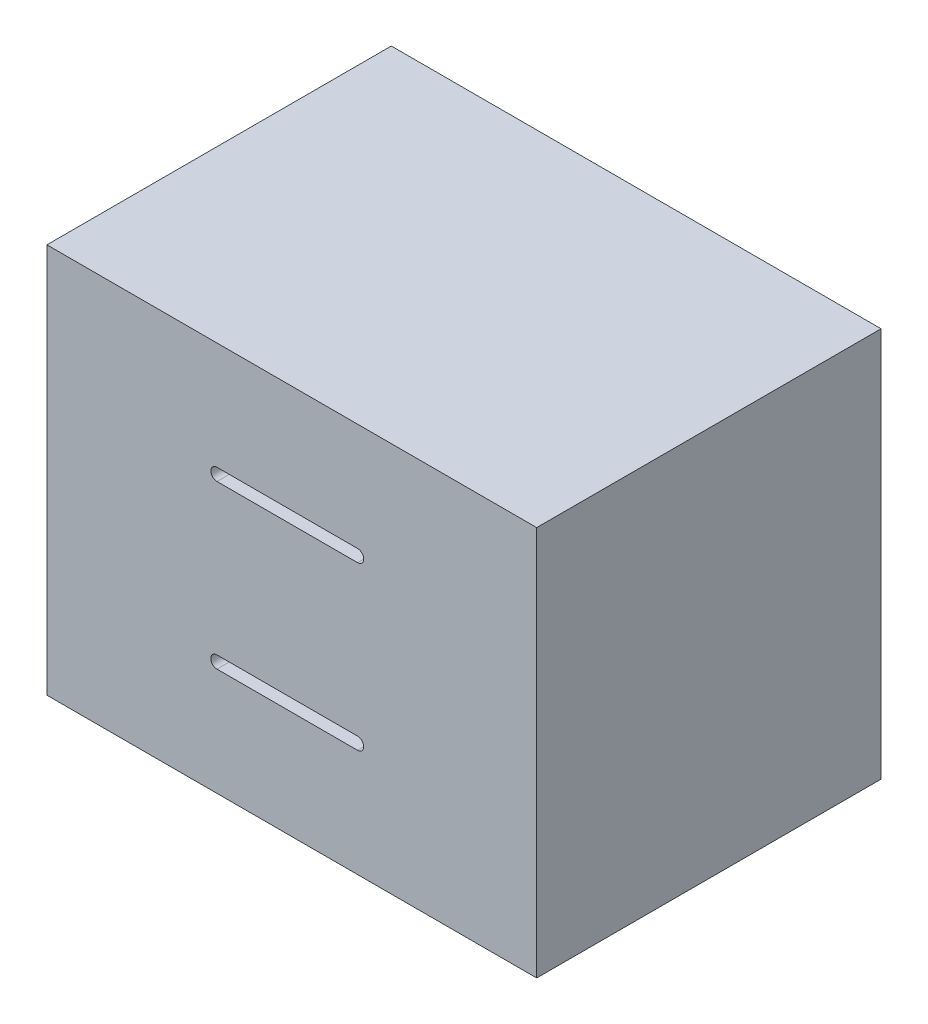
ISO-10303-21;
HEADER;
FILE_DESCRIPTION(('STEP AP214'),'2;1');
FILE_NAME('part.step','',(''),(''),'','','');
FILE_SCHEMA(('AUTOMOTIVE_DESIGN { 1 0 10303 214 1 1 1 1 }'));
ENDSEC;
DATA;
#1=APPLICATION_CONTEXT('core data for automotive mechanical design processes');
#2=APPLICATION_PROTOCOL_DEFINITION('international standard','automotive_design',2000,#1);
#3=PRODUCT_CONTEXT('',#1,'mechanical');
#4=PRODUCT('Part','Part','',(#3));
#5=PRODUCT_RELATED_PRODUCT_CATEGORY('part','',(#4));
#6=PRODUCT_DEFINITION_FORMATION('','',#4);
#7=PRODUCT_DEFINITION_CONTEXT('part definition',#1,'design');
#8=PRODUCT_DEFINITION('design','',#6,#7);
#9=PRODUCT_DEFINITION_SHAPE('','',#8);
#10=(LENGTH_UNIT() NAMED_UNIT(*) SI_UNIT(.MILLI.,.METRE.));
#11=(NAMED_UNIT(*) PLANE_ANGLE_UNIT() SI_UNIT($,.RADIAN.));
#12=(NAMED_UNIT(*) SI_UNIT($,.STERADIAN.) SOLID_ANGLE_UNIT());
#13=UNCERTAINTY_MEASURE_WITH_UNIT(LENGTH_MEASURE(1.E-05),#10,'distance_accuracy_value','');
#14=(GEOMETRIC_REPRESENTATION_CONTEXT(3) GLOBAL_UNCERTAINTY_ASSIGNED_CONTEXT((#13)) GLOBAL_UNIT_ASSIGNED_CONTEXT((#10,
#11,#12)) REPRESENTATION_CONTEXT('',''));
#15=CARTESIAN_POINT('',(0.,0.,0.));
#16=DIRECTION('',(0.,0.,1.));
#17=DIRECTION('',(1.,0.,0.));
#18=AXIS2_PLACEMENT_3D('',#15,#16,#17);
#19=CARTESIAN_POINT('',(-26.9,42.85,18.915));
#20=DIRECTION('',(0.,0.,-1.));
#21=DIRECTION('',(-1.,0.,0.));
#22=AXIS2_PLACEMENT_3D('',#19,#20,#21);
#23=PLANE('',#22);
#24=CARTESIAN_POINT('',(7.225,12.5,18.915));
#25=DIRECTION('',(0.,0.,-1.));
#26=DIRECTION('',(-1.,0.,0.));
#27=AXIS2_PLACEMENT_3D('',#24,#25,#26);
#28=CIRCLE('',#27,0.675);
#29=CARTESIAN_POINT('',(7.22500000000001,13.175,18.915));
#30=VERTEX_POINT('',#29);
#31=CARTESIAN_POINT('',(7.225,11.825,18.915));
#32=VERTEX_POINT('',#31);
#33=EDGE_CURVE('E70',#30,#32,#28,.T.);
#34=ORIENTED_EDGE('',*,*,#33,.T.);
#35=DIRECTION('',(-1.,0.,0.));
#36=VECTOR('',#35,1.);
#37=CARTESIAN_POINT('',(7.225,11.825,18.915));
#38=LINE('',#37,#36);
#39=CARTESIAN_POINT('',(-8.225,11.825,18.915));
#40=VERTEX_POINT('',#39);
#41=EDGE_CURVE('E230',#32,#40,#38,.T.);
#42=ORIENTED_EDGE('',*,*,#41,.T.);
#43=CARTESIAN_POINT('',(-8.225,12.5,18.915));
#44=DIRECTION('',(0.,0.,-1.));
#45=DIRECTION('',(-1.,0.,0.));
#46=AXIS2_PLACEMENT_3D('',#43,#44,#45);
#47=CIRCLE('',#46,0.675);
#48=CARTESIAN_POINT('',(-8.225,13.175,18.915));
#49=VERTEX_POINT('',#48);
#50=EDGE_CURVE('E241',#40,#49,#47,.T.);
#51=ORIENTED_EDGE('',*,*,#50,.T.);
#52=DIRECTION('',(1.,0.,0.));
#53=VECTOR('',#52,1.);
#54=CARTESIAN_POINT('',(7.225,13.175,18.915));
#55=LINE('',#54,#53);
#56=EDGE_CURVE('E238',#49,#30,#55,.T.);
#57=ORIENTED_EDGE('',*,*,#56,.T.);
#58=EDGE_LOOP('',(#34,#42,#51,#57));
#59=FACE_BOUND('',#58,.T.);
#60=DIRECTION('',(1.,0.,0.));
#61=VECTOR('',#60,1.);
#62=CARTESIAN_POINT('',(-26.9,0.,18.915));
#63=LINE('',#62,#61);
#64=CARTESIAN_POINT('',(-26.9,0.,18.915));
#65=VERTEX_POINT('',#64);
#66=CARTESIAN_POINT('',(26.9,0.,18.915));
#67=VERTEX_POINT('',#66);
#68=EDGE_CURVE('E320',#65,#67,#63,.T.);
#69=ORIENTED_EDGE('',*,*,#68,.T.);
#70=DIRECTION('',(0.,-1.,0.));
#71=VECTOR('',#70,1.);
#72=CARTESIAN_POINT('',(26.9,42.85,18.915));
#73=LINE('',#72,#71);
#74=CARTESIAN_POINT('',(26.9,42.85,18.915));
#75=VERTEX_POINT('',#74);
#76=EDGE_CURVE('E326',#75,#67,#73,.T.);
#77=ORIENTED_EDGE('',*,*,#76,.F.);
#78=DIRECTION('',(1.,0.,0.));
#79=VECTOR('',#78,1.);
#80=CARTESIAN_POINT('',(-26.9,42.85,18.915));
#81=LINE('',#80,#79);
#82=CARTESIAN_POINT('',(-26.9,42.85,18.915));
#83=VERTEX_POINT('',#82);
#84=EDGE_CURVE('E324',#83,#75,#81,.T.);
#85=ORIENTED_EDGE('',*,*,#84,.F.);
#86=DIRECTION('',(0.,-1.,0.));
#87=VECTOR('',#86,1.);
#88=CARTESIAN_POINT('',(-26.9,42.85,18.915));
#89=LINE('',#88,#87);
#90=EDGE_CURVE('E336',#83,#65,#89,.T.);
#91=ORIENTED_EDGE('',*,*,#90,.T.);
#92=EDGE_LOOP('',(#69,#77,#85,#91));
#93=FACE_BOUND('',#92,.T.);
#94=CARTESIAN_POINT('',(7.225,30.35,18.915));
#95=DIRECTION('',(0.,0.,-1.));
#96=DIRECTION('',(-1.,0.,0.));
#97=AXIS2_PLACEMENT_3D('',#94,#95,#96);
#98=CIRCLE('',#97,0.674999999999998);
#99=CARTESIAN_POINT('',(7.22500000000001,31.025,18.915));
#100=VERTEX_POINT('',#99);
#101=CARTESIAN_POINT('',(7.225,29.675,18.915));
#102=VERTEX_POINT('',#101);
#103=EDGE_CURVE('E62',#100,#102,#98,.T.);
#104=ORIENTED_EDGE('',*,*,#103,.T.);
#105=DIRECTION('',(-1.,0.,0.));
#106=VECTOR('',#105,1.);
#107=CARTESIAN_POINT('',(7.225,29.675,18.915));
#108=LINE('',#107,#106);
#109=CARTESIAN_POINT('',(-8.225,29.675,18.915));
#110=VERTEX_POINT('',#109);
#111=EDGE_CURVE('E206',#102,#110,#108,.T.);
#112=ORIENTED_EDGE('',*,*,#111,.T.);
#113=CARTESIAN_POINT('',(-8.225,30.35,18.915));
#114=DIRECTION('',(0.,0.,-1.));
#115=DIRECTION('',(-1.,0.,0.));
#116=AXIS2_PLACEMENT_3D('',#113,#114,#115);
#117=CIRCLE('',#116,0.674999999999998);
#118=CARTESIAN_POINT('',(-8.225,31.025,18.915));
#119=VERTEX_POINT('',#118);
#120=EDGE_CURVE('E209',#110,#119,#117,.T.);
#121=ORIENTED_EDGE('',*,*,#120,.T.);
#122=DIRECTION('',(1.,0.,0.));
#123=VECTOR('',#122,1.);
#124=CARTESIAN_POINT('',(7.225,31.025,18.915));
#125=LINE('',#124,#123);
#126=EDGE_CURVE('E215',#119,#100,#125,.T.);
#127=ORIENTED_EDGE('',*,*,#126,.T.);
#128=EDGE_LOOP('',(#104,#112,#121,#127));
#129=FACE_BOUND('',#128,.T.);
#130=ADVANCED_FACE('F47',(#59,#93,#129),#23,.F.);
#131=CARTESIAN_POINT('',(26.9,42.85,18.915));
#132=DIRECTION('',(-1.,0.,0.));
#133=DIRECTION('',(0.,0.,1.));
#134=AXIS2_PLACEMENT_3D('',#131,#132,#133);
#135=PLANE('',#134);
#136=DIRECTION('',(0.,0.,-1.));
#137=VECTOR('',#136,1.);
#138=CARTESIAN_POINT('',(26.9,0.,18.915));
#139=LINE('',#138,#137);
#140=CARTESIAN_POINT('',(26.9,0.,-18.915));
#141=VERTEX_POINT('',#140);
#142=EDGE_CURVE('E279',#67,#141,#139,.T.);
#143=ORIENTED_EDGE('',*,*,#142,.T.);
#144=DIRECTION('',(0.,-1.,0.));
#145=VECTOR('',#144,1.);
#146=CARTESIAN_POINT('',(26.9,42.85,-18.915));
#147=LINE('',#146,#145);
#148=CARTESIAN_POINT('',(26.9,42.85,-18.915));
#149=VERTEX_POINT('',#148);
#150=EDGE_CURVE('E11',#149,#141,#147,.T.);
#151=ORIENTED_EDGE('',*,*,#150,.F.);
#152=DIRECTION('',(0.,0.,-1.));
#153=VECTOR('',#152,1.);
#154=CARTESIAN_POINT('',(26.9,42.85,18.915));
#155=LINE('',#154,#153);
#156=EDGE_CURVE('E316',#75,#149,#155,.T.);
#157=ORIENTED_EDGE('',*,*,#156,.F.);
#158=ORIENTED_EDGE('',*,*,#76,.T.);
#159=EDGE_LOOP('',(#143,#151,#157,#158));
#160=FACE_BOUND('',#159,.T.);
#161=ADVANCED_FACE('F49',(#160),#135,.F.);
#162=CARTESIAN_POINT('',(-26.9,42.85,-18.915));
#163=DIRECTION('',(0.,0.,1.));
#164=DIRECTION('',(1.,0.,0.));
#165=AXIS2_PLACEMENT_3D('',#162,#163,#164);
#166=PLANE('',#165);
#167=DIRECTION('',(-1.,0.,0.));
#168=VECTOR('',#167,1.);
#169=CARTESIAN_POINT('',(7.225,29.675,-18.915));
#170=LINE('',#169,#168);
#171=CARTESIAN_POINT('',(7.22500000000001,29.675,-18.915));
#172=VERTEX_POINT('',#171);
#173=CARTESIAN_POINT('',(-8.225,29.675,-18.915));
#174=VERTEX_POINT('',#173);
#175=EDGE_CURVE('E268',#172,#174,#170,.T.);
#176=ORIENTED_EDGE('',*,*,#175,.F.);
#177=CARTESIAN_POINT('',(7.225,30.35,-18.915));
#178=DIRECTION('',(0.,0.,-1.));
#179=DIRECTION('',(-1.,0.,0.));
#180=AXIS2_PLACEMENT_3D('',#177,#178,#179);
#181=CIRCLE('',#180,0.674999999999998);
#182=CARTESIAN_POINT('',(7.225,31.025,-18.915));
#183=VERTEX_POINT('',#182);
#184=EDGE_CURVE('E266',#183,#172,#181,.T.);
#185=ORIENTED_EDGE('',*,*,#184,.F.);
#186=DIRECTION('',(1.,0.,0.));
#187=VECTOR('',#186,1.);
#188=CARTESIAN_POINT('',(7.225,31.025,-18.915));
#189=LINE('',#188,#187);
#190=CARTESIAN_POINT('',(-8.225,31.025,-18.915));
#191=VERTEX_POINT('',#190);
#192=EDGE_CURVE('E256',#191,#183,#189,.T.);
#193=ORIENTED_EDGE('',*,*,#192,.F.);
#194=CARTESIAN_POINT('',(-8.225,30.35,-18.915));
#195=DIRECTION('',(0.,0.,-1.));
#196=DIRECTION('',(-1.,0.,0.));
#197=AXIS2_PLACEMENT_3D('',#194,#195,#196);
#198=CIRCLE('',#197,0.674999999999998);
#199=EDGE_CURVE('E272',#174,#191,#198,.T.);
#200=ORIENTED_EDGE('',*,*,#199,.F.);
#201=EDGE_LOOP('',(#176,#185,#193,#200));
#202=FACE_BOUND('',#201,.T.);
#203=DIRECTION('',(-1.,0.,0.));
#204=VECTOR('',#203,1.);
#205=CARTESIAN_POINT('',(7.225,11.825,-18.915));
#206=LINE('',#205,#204);
#207=CARTESIAN_POINT('',(7.22500000000001,11.825,-18.915));
#208=VERTEX_POINT('',#207);
#209=CARTESIAN_POINT('',(-8.225,11.825,-18.915));
#210=VERTEX_POINT('',#209);
#211=EDGE_CURVE('E302',#208,#210,#206,.T.);
#212=ORIENTED_EDGE('',*,*,#211,.F.);
#213=CARTESIAN_POINT('',(7.225,12.5,-18.915));
#214=DIRECTION('',(0.,0.,-1.));
#215=DIRECTION('',(-1.,0.,0.));
#216=AXIS2_PLACEMENT_3D('',#213,#214,#215);
#217=CIRCLE('',#216,0.675);
#218=CARTESIAN_POINT('',(7.225,13.175,-18.915));
#219=VERTEX_POINT('',#218);
#220=EDGE_CURVE('E269',#219,#208,#217,.T.);
#221=ORIENTED_EDGE('',*,*,#220,.F.);
#222=DIRECTION('',(1.,0.,0.));
#223=VECTOR('',#222,1.);
#224=CARTESIAN_POINT('',(7.225,13.175,-18.915));
#225=LINE('',#224,#223);
#226=CARTESIAN_POINT('',(-8.225,13.175,-18.915));
#227=VERTEX_POINT('',#226);
#228=EDGE_CURVE('E295',#227,#219,#225,.T.);
#229=ORIENTED_EDGE('',*,*,#228,.F.);
#230=CARTESIAN_POINT('',(-8.225,12.5,-18.915));
#231=DIRECTION('',(0.,0.,-1.));
#232=DIRECTION('',(-1.,0.,0.));
#233=AXIS2_PLACEMENT_3D('',#230,#231,#232);
#234=CIRCLE('',#233,0.675);
#235=EDGE_CURVE('E298',#210,#227,#234,.T.);
#236=ORIENTED_EDGE('',*,*,#235,.F.);
#237=EDGE_LOOP('',(#212,#221,#229,#236));
#238=FACE_BOUND('',#237,.T.);
#239=DIRECTION('',(-1.,0.,0.));
#240=VECTOR('',#239,1.);
#241=CARTESIAN_POINT('',(-26.9,0.,-18.915));
#242=LINE('',#241,#240);
#243=CARTESIAN_POINT('',(-26.9,0.,-18.915));
#244=VERTEX_POINT('',#243);
#245=EDGE_CURVE('E329',#141,#244,#242,.T.);
#246=ORIENTED_EDGE('',*,*,#245,.T.);
#247=DIRECTION('',(0.,-1.,0.));
#248=VECTOR('',#247,1.);
#249=CARTESIAN_POINT('',(-26.9,42.85,-18.915));
#250=LINE('',#249,#248);
#251=CARTESIAN_POINT('',(-26.9,42.85,-18.915));
#252=VERTEX_POINT('',#251);
#253=EDGE_CURVE('E55',#252,#244,#250,.T.);
#254=ORIENTED_EDGE('',*,*,#253,.F.);
#255=DIRECTION('',(-1.,0.,0.));
#256=VECTOR('',#255,1.);
#257=CARTESIAN_POINT('',(-26.9,42.85,-18.915));
#258=LINE('',#257,#256);
#259=EDGE_CURVE('E319',#149,#252,#258,.T.);
#260=ORIENTED_EDGE('',*,*,#259,.F.);
#261=ORIENTED_EDGE('',*,*,#150,.T.);
#262=EDGE_LOOP('',(#246,#254,#260,#261));
#263=FACE_BOUND('',#262,.T.);
#264=ADVANCED_FACE('F359',(#202,#238,#263),#166,.F.);
#265=CARTESIAN_POINT('',(-26.9,42.85,18.915));
#266=DIRECTION('',(1.,0.,0.));
#267=DIRECTION('',(0.,0.,-1.));
#268=AXIS2_PLACEMENT_3D('',#265,#266,#267);
#269=PLANE('',#268);
#270=DIRECTION('',(0.,0.,1.));
#271=VECTOR('',#270,1.);
#272=CARTESIAN_POINT('',(-26.9,0.,18.915));
#273=LINE('',#272,#271);
#274=EDGE_CURVE('E331',#244,#65,#273,.T.);
#275=ORIENTED_EDGE('',*,*,#274,.T.);
#276=ORIENTED_EDGE('',*,*,#90,.F.);
#277=DIRECTION('',(0.,0.,1.));
#278=VECTOR('',#277,1.);
#279=CARTESIAN_POINT('',(-26.9,42.85,18.915));
#280=LINE('',#279,#278);
#281=EDGE_CURVE('E322',#252,#83,#280,.T.);
#282=ORIENTED_EDGE('',*,*,#281,.F.);
#283=ORIENTED_EDGE('',*,*,#253,.T.);
#284=EDGE_LOOP('',(#275,#276,#282,#283));
#285=FACE_BOUND('',#284,.T.);
#286=ADVANCED_FACE('F343',(#285),#269,.F.);
#287=CARTESIAN_POINT('',(0.,42.85,0.));
#288=DIRECTION('',(0.,-1.,0.));
#289=DIRECTION('',(0.,0.,-1.));
#290=AXIS2_PLACEMENT_3D('',#287,#288,#289);
#291=PLANE('',#290);
#292=ORIENTED_EDGE('',*,*,#156,.T.);
#293=ORIENTED_EDGE('',*,*,#259,.T.);
#294=ORIENTED_EDGE('',*,*,#281,.T.);
#295=ORIENTED_EDGE('',*,*,#84,.T.);
#296=EDGE_LOOP('',(#292,#293,#294,#295));
#297=FACE_BOUND('',#296,.T.);
#298=ADVANCED_FACE('F358',(#297),#291,.F.);
#299=CARTESIAN_POINT('',(0.,0.,0.));
#300=DIRECTION('',(0.,-1.,0.));
#301=DIRECTION('',(0.,0.,-1.));
#302=AXIS2_PLACEMENT_3D('',#299,#300,#301);
#303=PLANE('',#302);
#304=ORIENTED_EDGE('',*,*,#142,.F.);
#305=ORIENTED_EDGE('',*,*,#68,.F.);
#306=ORIENTED_EDGE('',*,*,#274,.F.);
#307=ORIENTED_EDGE('',*,*,#245,.F.);
#308=EDGE_LOOP('',(#304,#305,#306,#307));
#309=FACE_BOUND('',#308,.T.);
#310=ADVANCED_FACE('F349',(#309),#303,.T.);
#311=CARTESIAN_POINT('',(7.225,12.5,-16.915));
#312=DIRECTION('',(0.,0.,-1.));
#313=DIRECTION('',(-1.,0.,0.));
#314=AXIS2_PLACEMENT_3D('',#311,#312,#313);
#315=CYLINDRICAL_SURFACE('',#314,0.675);
#316=ORIENTED_EDGE('',*,*,#220,.T.);
#317=DIRECTION('',(0.,0.,-1.));
#318=VECTOR('',#317,1.);
#319=CARTESIAN_POINT('',(7.225,11.825,-16.915));
#320=LINE('',#319,#318);
#321=CARTESIAN_POINT('',(7.225,11.825,-16.915));
#322=VERTEX_POINT('',#321);
#323=EDGE_CURVE('E286',#322,#208,#320,.T.);
#324=ORIENTED_EDGE('',*,*,#323,.F.);
#325=CARTESIAN_POINT('',(7.225,12.5,-16.915));
#326=DIRECTION('',(0.,0.,-1.));
#327=DIRECTION('',(-1.,0.,0.));
#328=AXIS2_PLACEMENT_3D('',#325,#326,#327);
#329=CIRCLE('',#328,0.675);
#330=CARTESIAN_POINT('',(7.225,13.175,-16.915));
#331=VERTEX_POINT('',#330);
#332=EDGE_CURVE('E299',#331,#322,#329,.T.);
#333=ORIENTED_EDGE('',*,*,#332,.F.);
#334=DIRECTION('',(0.,0.,-1.));
#335=VECTOR('',#334,1.);
#336=CARTESIAN_POINT('',(7.225,13.175,-16.915));
#337=LINE('',#336,#335);
#338=EDGE_CURVE('E222',#331,#219,#337,.T.);
#339=ORIENTED_EDGE('',*,*,#338,.T.);
#340=EDGE_LOOP('',(#316,#324,#333,#339));
#341=FACE_BOUND('',#340,.T.);
#342=ADVANCED_FACE('F380',(#341),#315,.F.);
#343=CARTESIAN_POINT('',(7.225,13.175,-16.915));
#344=DIRECTION('',(0.,1.,0.));
#345=DIRECTION('',(0.,0.,1.));
#346=AXIS2_PLACEMENT_3D('',#343,#344,#345);
#347=PLANE('',#346);
#348=ORIENTED_EDGE('',*,*,#228,.T.);
#349=ORIENTED_EDGE('',*,*,#338,.F.);
#350=DIRECTION('',(1.,0.,0.));
#351=VECTOR('',#350,1.);
#352=CARTESIAN_POINT('',(7.225,13.175,-16.915));
#353=LINE('',#352,#351);
#354=CARTESIAN_POINT('',(-8.225,13.175,-16.915));
#355=VERTEX_POINT('',#354);
#356=EDGE_CURVE('E289',#355,#331,#353,.T.);
#357=ORIENTED_EDGE('',*,*,#356,.F.);
#358=DIRECTION('',(0.,0.,-1.));
#359=VECTOR('',#358,1.);
#360=CARTESIAN_POINT('',(-8.225,13.175,-16.915));
#361=LINE('',#360,#359);
#362=EDGE_CURVE('E292',#355,#227,#361,.T.);
#363=ORIENTED_EDGE('',*,*,#362,.T.);
#364=EDGE_LOOP('',(#348,#349,#357,#363));
#365=FACE_BOUND('',#364,.T.);
#366=ADVANCED_FACE('F389',(#365),#347,.F.);
#367=CARTESIAN_POINT('',(-8.225,12.5,-16.915));
#368=DIRECTION('',(0.,0.,-1.));
#369=DIRECTION('',(-1.,0.,0.));
#370=AXIS2_PLACEMENT_3D('',#367,#368,#369);
#371=CYLINDRICAL_SURFACE('',#370,0.675);
#372=ORIENTED_EDGE('',*,*,#235,.T.);
#373=ORIENTED_EDGE('',*,*,#362,.F.);
#374=CARTESIAN_POINT('',(-8.225,12.5,-16.915));
#375=DIRECTION('',(0.,0.,-1.));
#376=DIRECTION('',(-1.,0.,0.));
#377=AXIS2_PLACEMENT_3D('',#374,#375,#376);
#378=CIRCLE('',#377,0.675);
#379=CARTESIAN_POINT('',(-8.225,11.825,-16.915));
#380=VERTEX_POINT('',#379);
#381=EDGE_CURVE('E308',#380,#355,#378,.T.);
#382=ORIENTED_EDGE('',*,*,#381,.F.);
#383=DIRECTION('',(0.,0.,-1.));
#384=VECTOR('',#383,1.);
#385=CARTESIAN_POINT('',(-8.225,11.825,-16.915));
#386=LINE('',#385,#384);
#387=EDGE_CURVE('E290',#380,#210,#386,.T.);
#388=ORIENTED_EDGE('',*,*,#387,.T.);
#389=EDGE_LOOP('',(#372,#373,#382,#388));
#390=FACE_BOUND('',#389,.T.);
#391=ADVANCED_FACE('F392',(#390),#371,.F.);
#392=CARTESIAN_POINT('',(7.225,11.825,-16.915));
#393=DIRECTION('',(0.,-1.,0.));
#394=DIRECTION('',(0.,0.,-1.));
#395=AXIS2_PLACEMENT_3D('',#392,#393,#394);
#396=PLANE('',#395);
#397=ORIENTED_EDGE('',*,*,#211,.T.);
#398=ORIENTED_EDGE('',*,*,#387,.F.);
#399=DIRECTION('',(-1.,0.,0.));
#400=VECTOR('',#399,1.);
#401=CARTESIAN_POINT('',(7.225,11.825,-16.915));
#402=LINE('',#401,#400);
#403=EDGE_CURVE('E311',#322,#380,#402,.T.);
#404=ORIENTED_EDGE('',*,*,#403,.F.);
#405=ORIENTED_EDGE('',*,*,#323,.T.);
#406=EDGE_LOOP('',(#397,#398,#404,#405));
#407=FACE_BOUND('',#406,.T.);
#408=ADVANCED_FACE('F387',(#407),#396,.F.);
#409=CARTESIAN_POINT('',(7.225,12.5,-16.915));
#410=DIRECTION('',(0.,0.,-1.));
#411=DIRECTION('',(-1.,0.,0.));
#412=AXIS2_PLACEMENT_3D('',#409,#410,#411);
#413=PLANE('',#412);
#414=ORIENTED_EDGE('',*,*,#332,.T.);
#415=ORIENTED_EDGE('',*,*,#403,.T.);
#416=ORIENTED_EDGE('',*,*,#381,.T.);
#417=ORIENTED_EDGE('',*,*,#356,.T.);
#418=EDGE_LOOP('',(#414,#415,#416,#417));
#419=FACE_BOUND('',#418,.T.);
#420=ADVANCED_FACE('F383',(#419),#413,.T.);
#421=CARTESIAN_POINT('',(7.225,30.35,-16.915));
#422=DIRECTION('',(0.,0.,-1.));
#423=DIRECTION('',(-1.,0.,0.));
#424=AXIS2_PLACEMENT_3D('',#421,#422,#423);
#425=CYLINDRICAL_SURFACE('',#424,0.674999999999998);
#426=ORIENTED_EDGE('',*,*,#184,.T.);
#427=DIRECTION('',(0.,0.,-1.));
#428=VECTOR('',#427,1.);
#429=CARTESIAN_POINT('',(7.225,29.675,-16.915));
#430=LINE('',#429,#428);
#431=CARTESIAN_POINT('',(7.225,29.675,-16.915));
#432=VERTEX_POINT('',#431);
#433=EDGE_CURVE('E265',#432,#172,#430,.T.);
#434=ORIENTED_EDGE('',*,*,#433,.F.);
#435=CARTESIAN_POINT('',(7.225,30.35,-16.915));
#436=DIRECTION('',(0.,0.,-1.));
#437=DIRECTION('',(-1.,0.,0.));
#438=AXIS2_PLACEMENT_3D('',#435,#436,#437);
#439=CIRCLE('',#438,0.674999999999998);
#440=CARTESIAN_POINT('',(7.225,31.025,-16.915));
#441=VERTEX_POINT('',#440);
#442=EDGE_CURVE('E252',#441,#432,#439,.T.);
#443=ORIENTED_EDGE('',*,*,#442,.F.);
#444=DIRECTION('',(0.,0.,-1.));
#445=VECTOR('',#444,1.);
#446=CARTESIAN_POINT('',(7.225,31.025,-16.915));
#447=LINE('',#446,#445);
#448=EDGE_CURVE('E277',#441,#183,#447,.T.);
#449=ORIENTED_EDGE('',*,*,#448,.T.);
#450=EDGE_LOOP('',(#426,#434,#443,#449));
#451=FACE_BOUND('',#450,.T.);
#452=ADVANCED_FACE('F386',(#451),#425,.F.);
#453=CARTESIAN_POINT('',(7.225,31.025,-16.915));
#454=DIRECTION('',(0.,1.,0.));
#455=DIRECTION('',(0.,0.,1.));
#456=AXIS2_PLACEMENT_3D('',#453,#454,#455);
#457=PLANE('',#456);
#458=ORIENTED_EDGE('',*,*,#192,.T.);
#459=ORIENTED_EDGE('',*,*,#448,.F.);
#460=DIRECTION('',(1.,0.,0.));
#461=VECTOR('',#460,1.);
#462=CARTESIAN_POINT('',(7.225,31.025,-16.915));
#463=LINE('',#462,#461);
#464=CARTESIAN_POINT('',(-8.225,31.025,-16.915));
#465=VERTEX_POINT('',#464);
#466=EDGE_CURVE('E262',#465,#441,#463,.T.);
#467=ORIENTED_EDGE('',*,*,#466,.F.);
#468=DIRECTION('',(0.,0.,-1.));
#469=VECTOR('',#468,1.);
#470=CARTESIAN_POINT('',(-8.225,31.025,-16.915));
#471=LINE('',#470,#469);
#472=EDGE_CURVE('E280',#465,#191,#471,.T.);
#473=ORIENTED_EDGE('',*,*,#472,.T.);
#474=EDGE_LOOP('',(#458,#459,#467,#473));
#475=FACE_BOUND('',#474,.T.);
#476=ADVANCED_FACE('F404',(#475),#457,.F.);
#477=CARTESIAN_POINT('',(-8.225,30.35,-16.915));
#478=DIRECTION('',(0.,0.,-1.));
#479=DIRECTION('',(-1.,0.,0.));
#480=AXIS2_PLACEMENT_3D('',#477,#478,#479);
#481=CYLINDRICAL_SURFACE('',#480,0.674999999999998);
#482=ORIENTED_EDGE('',*,*,#199,.T.);
#483=ORIENTED_EDGE('',*,*,#472,.F.);
#484=CARTESIAN_POINT('',(-8.225,30.35,-16.915));
#485=DIRECTION('',(0.,0.,-1.));
#486=DIRECTION('',(-1.,0.,0.));
#487=AXIS2_PLACEMENT_3D('',#484,#485,#486);
#488=CIRCLE('',#487,0.674999999999998);
#489=CARTESIAN_POINT('',(-8.225,29.675,-16.915));
#490=VERTEX_POINT('',#489);
#491=EDGE_CURVE('E259',#490,#465,#488,.T.);
#492=ORIENTED_EDGE('',*,*,#491,.F.);
#493=DIRECTION('',(0.,0.,-1.));
#494=VECTOR('',#493,1.);
#495=CARTESIAN_POINT('',(-8.225,29.675,-16.915));
#496=LINE('',#495,#494);
#497=EDGE_CURVE('E282',#490,#174,#496,.T.);
#498=ORIENTED_EDGE('',*,*,#497,.T.);
#499=EDGE_LOOP('',(#482,#483,#492,#498));
#500=FACE_BOUND('',#499,.T.);
#501=ADVANCED_FACE('F410',(#500),#481,.F.);
#502=CARTESIAN_POINT('',(7.225,29.675,-16.915));
#503=DIRECTION('',(0.,-1.,0.));
#504=DIRECTION('',(0.,0.,-1.));
#505=AXIS2_PLACEMENT_3D('',#502,#503,#504);
#506=PLANE('',#505);
#507=ORIENTED_EDGE('',*,*,#175,.T.);
#508=ORIENTED_EDGE('',*,*,#497,.F.);
#509=DIRECTION('',(-1.,0.,0.));
#510=VECTOR('',#509,1.);
#511=CARTESIAN_POINT('',(7.225,29.675,-16.915));
#512=LINE('',#511,#510);
#513=EDGE_CURVE('E255',#432,#490,#512,.T.);
#514=ORIENTED_EDGE('',*,*,#513,.F.);
#515=ORIENTED_EDGE('',*,*,#433,.T.);
#516=EDGE_LOOP('',(#507,#508,#514,#515));
#517=FACE_BOUND('',#516,.T.);
#518=ADVANCED_FACE('F406',(#517),#506,.F.);
#519=CARTESIAN_POINT('',(7.225,30.35,-16.915));
#520=DIRECTION('',(0.,0.,-1.));
#521=DIRECTION('',(-1.,0.,0.));
#522=AXIS2_PLACEMENT_3D('',#519,#520,#521);
#523=PLANE('',#522);
#524=ORIENTED_EDGE('',*,*,#442,.T.);
#525=ORIENTED_EDGE('',*,*,#513,.T.);
#526=ORIENTED_EDGE('',*,*,#491,.T.);
#527=ORIENTED_EDGE('',*,*,#466,.T.);
#528=EDGE_LOOP('',(#524,#525,#526,#527));
#529=FACE_BOUND('',#528,.T.);
#530=ADVANCED_FACE('F409',(#529),#523,.T.);
#531=CARTESIAN_POINT('',(7.225,12.5,16.915));
#532=DIRECTION('',(0.,0.,1.));
#533=DIRECTION('',(1.,0.,0.));
#534=AXIS2_PLACEMENT_3D('',#531,#532,#533);
#535=CYLINDRICAL_SURFACE('',#534,0.675);
#536=ORIENTED_EDGE('',*,*,#33,.F.);
#537=DIRECTION('',(0.,0.,1.));
#538=VECTOR('',#537,1.);
#539=CARTESIAN_POINT('',(7.225,13.175,16.915));
#540=LINE('',#539,#538);
#541=CARTESIAN_POINT('',(7.225,13.175,16.915));
#542=VERTEX_POINT('',#541);
#543=EDGE_CURVE('E236',#542,#30,#540,.T.);
#544=ORIENTED_EDGE('',*,*,#543,.F.);
#545=CARTESIAN_POINT('',(7.225,12.5,16.915));
#546=DIRECTION('',(0.,0.,-1.));
#547=DIRECTION('',(-1.,0.,0.));
#548=AXIS2_PLACEMENT_3D('',#545,#546,#547);
#549=CIRCLE('',#548,0.675);
#550=CARTESIAN_POINT('',(7.225,11.825,16.915));
#551=VERTEX_POINT('',#550);
#552=EDGE_CURVE('E226',#542,#551,#549,.T.);
#553=ORIENTED_EDGE('',*,*,#552,.T.);
#554=DIRECTION('',(0.,0.,1.));
#555=VECTOR('',#554,1.);
#556=CARTESIAN_POINT('',(7.225,11.825,16.915));
#557=LINE('',#556,#555);
#558=EDGE_CURVE('E216',#551,#32,#557,.T.);
#559=ORIENTED_EDGE('',*,*,#558,.T.);
#560=EDGE_LOOP('',(#536,#544,#553,#559));
#561=FACE_BOUND('',#560,.T.);
#562=ADVANCED_FACE('F419',(#561),#535,.F.);
#563=CARTESIAN_POINT('',(7.225,11.825,16.915));
#564=DIRECTION('',(0.,1.,0.));
#565=DIRECTION('',(0.,0.,1.));
#566=AXIS2_PLACEMENT_3D('',#563,#564,#565);
#567=PLANE('',#566);
#568=ORIENTED_EDGE('',*,*,#41,.F.);
#569=ORIENTED_EDGE('',*,*,#558,.F.);
#570=DIRECTION('',(-1.,0.,0.));
#571=VECTOR('',#570,1.);
#572=CARTESIAN_POINT('',(7.225,11.825,16.915));
#573=LINE('',#572,#571);
#574=CARTESIAN_POINT('',(-8.225,11.825,16.915));
#575=VERTEX_POINT('',#574);
#576=EDGE_CURVE('E234',#551,#575,#573,.T.);
#577=ORIENTED_EDGE('',*,*,#576,.T.);
#578=DIRECTION('',(0.,0.,1.));
#579=VECTOR('',#578,1.);
#580=CARTESIAN_POINT('',(-8.225,11.825,16.915));
#581=LINE('',#580,#579);
#582=EDGE_CURVE('E247',#575,#40,#581,.T.);
#583=ORIENTED_EDGE('',*,*,#582,.T.);
#584=EDGE_LOOP('',(#568,#569,#577,#583));
#585=FACE_BOUND('',#584,.T.);
#586=ADVANCED_FACE('F422',(#585),#567,.T.);
#587=CARTESIAN_POINT('',(-8.225,12.5,16.915));
#588=DIRECTION('',(0.,0.,1.));
#589=DIRECTION('',(1.,0.,0.));
#590=AXIS2_PLACEMENT_3D('',#587,#588,#589);
#591=CYLINDRICAL_SURFACE('',#590,0.675);
#592=ORIENTED_EDGE('',*,*,#50,.F.);
#593=ORIENTED_EDGE('',*,*,#582,.F.);
#594=CARTESIAN_POINT('',(-8.225,12.5,16.915));
#595=DIRECTION('',(0.,0.,-1.));
#596=DIRECTION('',(-1.,0.,0.));
#597=AXIS2_PLACEMENT_3D('',#594,#595,#596);
#598=CIRCLE('',#597,0.675);
#599=CARTESIAN_POINT('',(-8.225,13.175,16.915));
#600=VERTEX_POINT('',#599);
#601=EDGE_CURVE('E232',#575,#600,#598,.T.);
#602=ORIENTED_EDGE('',*,*,#601,.T.);
#603=DIRECTION('',(0.,0.,1.));
#604=VECTOR('',#603,1.);
#605=CARTESIAN_POINT('',(-8.225,13.175,16.915));
#606=LINE('',#605,#604);
#607=EDGE_CURVE('E249',#600,#49,#606,.T.);
#608=ORIENTED_EDGE('',*,*,#607,.T.);
#609=EDGE_LOOP('',(#592,#593,#602,#608));
#610=FACE_BOUND('',#609,.T.);
#611=ADVANCED_FACE('F427',(#610),#591,.F.);
#612=CARTESIAN_POINT('',(7.225,13.175,16.915));
#613=DIRECTION('',(0.,-1.,0.));
#614=DIRECTION('',(0.,0.,-1.));
#615=AXIS2_PLACEMENT_3D('',#612,#613,#614);
#616=PLANE('',#615);
#617=ORIENTED_EDGE('',*,*,#56,.F.);
#618=ORIENTED_EDGE('',*,*,#607,.F.);
#619=DIRECTION('',(1.,0.,0.));
#620=VECTOR('',#619,1.);
#621=CARTESIAN_POINT('',(7.225,13.175,16.915));
#622=LINE('',#621,#620);
#623=EDGE_CURVE('E229',#600,#542,#622,.T.);
#624=ORIENTED_EDGE('',*,*,#623,.T.);
#625=ORIENTED_EDGE('',*,*,#543,.T.);
#626=EDGE_LOOP('',(#617,#618,#624,#625));
#627=FACE_BOUND('',#626,.T.);
#628=ADVANCED_FACE('F423',(#627),#616,.T.);
#629=CARTESIAN_POINT('',(7.225,12.5,16.915));
#630=DIRECTION('',(0.,0.,1.));
#631=DIRECTION('',(-1.,0.,0.));
#632=AXIS2_PLACEMENT_3D('',#629,#630,#631);
#633=PLANE('',#632);
#634=ORIENTED_EDGE('',*,*,#552,.F.);
#635=ORIENTED_EDGE('',*,*,#623,.F.);
#636=ORIENTED_EDGE('',*,*,#601,.F.);
#637=ORIENTED_EDGE('',*,*,#576,.F.);
#638=EDGE_LOOP('',(#634,#635,#636,#637));
#639=FACE_BOUND('',#638,.T.);
#640=ADVANCED_FACE('F426',(#639),#633,.T.);
#641=CARTESIAN_POINT('',(7.225,30.35,16.915));
#642=DIRECTION('',(0.,0.,1.));
#643=DIRECTION('',(1.,0.,0.));
#644=AXIS2_PLACEMENT_3D('',#641,#642,#643);
#645=CYLINDRICAL_SURFACE('',#644,0.674999999999998);
#646=ORIENTED_EDGE('',*,*,#103,.F.);
#647=DIRECTION('',(0.,0.,1.));
#648=VECTOR('',#647,1.);
#649=CARTESIAN_POINT('',(7.225,31.025,16.915));
#650=LINE('',#649,#648);
#651=CARTESIAN_POINT('',(7.225,31.025,16.915));
#652=VERTEX_POINT('',#651);
#653=EDGE_CURVE('E191',#652,#100,#650,.T.);
#654=ORIENTED_EDGE('',*,*,#653,.F.);
#655=CARTESIAN_POINT('',(7.225,30.35,16.915));
#656=DIRECTION('',(0.,0.,-1.));
#657=DIRECTION('',(-1.,0.,0.));
#658=AXIS2_PLACEMENT_3D('',#655,#656,#657);
#659=CIRCLE('',#658,0.674999999999998);
#660=CARTESIAN_POINT('',(7.225,29.675,16.915));
#661=VERTEX_POINT('',#660);
#662=EDGE_CURVE('E198',#652,#661,#659,.T.);
#663=ORIENTED_EDGE('',*,*,#662,.T.);
#664=DIRECTION('',(0.,0.,1.));
#665=VECTOR('',#664,1.);
#666=CARTESIAN_POINT('',(7.225,29.675,16.915));
#667=LINE('',#666,#665);
#668=EDGE_CURVE('E220',#661,#102,#667,.T.);
#669=ORIENTED_EDGE('',*,*,#668,.T.);
#670=EDGE_LOOP('',(#646,#654,#663,#669));
#671=FACE_BOUND('',#670,.T.);
#672=ADVANCED_FACE('F201',(#671),#645,.F.);
#673=CARTESIAN_POINT('',(7.225,29.675,16.915));
#674=DIRECTION('',(0.,1.,0.));
#675=DIRECTION('',(0.,0.,1.));
#676=AXIS2_PLACEMENT_3D('',#673,#674,#675);
#677=PLANE('',#676);
#678=ORIENTED_EDGE('',*,*,#111,.F.);
#679=ORIENTED_EDGE('',*,*,#668,.F.);
#680=DIRECTION('',(-1.,0.,0.));
#681=VECTOR('',#680,1.);
#682=CARTESIAN_POINT('',(7.225,29.675,16.915));
#683=LINE('',#682,#681);
#684=CARTESIAN_POINT('',(-8.225,29.675,16.915));
#685=VERTEX_POINT('',#684);
#686=EDGE_CURVE('E203',#661,#685,#683,.T.);
#687=ORIENTED_EDGE('',*,*,#686,.T.);
#688=DIRECTION('',(0.,0.,1.));
#689=VECTOR('',#688,1.);
#690=CARTESIAN_POINT('',(-8.225,29.675,16.915));
#691=LINE('',#690,#689);
#692=EDGE_CURVE('E223',#685,#110,#691,.T.);
#693=ORIENTED_EDGE('',*,*,#692,.T.);
#694=EDGE_LOOP('',(#678,#679,#687,#693));
#695=FACE_BOUND('',#694,.T.);
#696=ADVANCED_FACE('F440',(#695),#677,.T.);
#697=CARTESIAN_POINT('',(-8.225,30.35,16.915));
#698=DIRECTION('',(0.,0.,1.));
#699=DIRECTION('',(1.,0.,0.));
#700=AXIS2_PLACEMENT_3D('',#697,#698,#699);
#701=CYLINDRICAL_SURFACE('',#700,0.674999999999998);
#702=ORIENTED_EDGE('',*,*,#120,.F.);
#703=ORIENTED_EDGE('',*,*,#692,.F.);
#704=CARTESIAN_POINT('',(-8.225,30.35,16.915));
#705=DIRECTION('',(0.,0.,-1.));
#706=DIRECTION('',(-1.,0.,0.));
#707=AXIS2_PLACEMENT_3D('',#704,#705,#706);
#708=CIRCLE('',#707,0.674999999999998);
#709=CARTESIAN_POINT('',(-8.225,31.025,16.915));
#710=VERTEX_POINT('',#709);
#711=EDGE_CURVE('E197',#685,#710,#708,.T.);
#712=ORIENTED_EDGE('',*,*,#711,.T.);
#713=DIRECTION('',(0.,0.,1.));
#714=VECTOR('',#713,1.);
#715=CARTESIAN_POINT('',(-8.225,31.025,16.915));
#716=LINE('',#715,#714);
#717=EDGE_CURVE('E193',#710,#119,#716,.T.);
#718=ORIENTED_EDGE('',*,*,#717,.T.);
#719=EDGE_LOOP('',(#702,#703,#712,#718));
#720=FACE_BOUND('',#719,.T.);
#721=ADVANCED_FACE('F443',(#720),#701,.F.);
#722=CARTESIAN_POINT('',(7.225,31.025,16.915));
#723=DIRECTION('',(0.,-1.,0.));
#724=DIRECTION('',(0.,0.,-1.));
#725=AXIS2_PLACEMENT_3D('',#722,#723,#724);
#726=PLANE('',#725);
#727=ORIENTED_EDGE('',*,*,#126,.F.);
#728=ORIENTED_EDGE('',*,*,#717,.F.);
#729=DIRECTION('',(1.,0.,0.));
#730=VECTOR('',#729,1.);
#731=CARTESIAN_POINT('',(7.225,31.025,16.915));
#732=LINE('',#731,#730);
#733=EDGE_CURVE('E188',#710,#652,#732,.T.);
#734=ORIENTED_EDGE('',*,*,#733,.T.);
#735=ORIENTED_EDGE('',*,*,#653,.T.);
#736=EDGE_LOOP('',(#727,#728,#734,#735));
#737=FACE_BOUND('',#736,.T.);
#738=ADVANCED_FACE('F190',(#737),#726,.T.);
#739=CARTESIAN_POINT('',(7.225,30.35,16.915));
#740=DIRECTION('',(0.,0.,1.));
#741=DIRECTION('',(-1.,0.,0.));
#742=AXIS2_PLACEMENT_3D('',#739,#740,#741);
#743=PLANE('',#742);
#744=ORIENTED_EDGE('',*,*,#662,.F.);
#745=ORIENTED_EDGE('',*,*,#733,.F.);
#746=ORIENTED_EDGE('',*,*,#711,.F.);
#747=ORIENTED_EDGE('',*,*,#686,.F.);
#748=EDGE_LOOP('',(#744,#745,#746,#747));
#749=FACE_BOUND('',#748,.T.);
#750=ADVANCED_FACE('F205',(#749),#743,.T.);
#751=CLOSED_SHELL('',(#130,#161,#264,#286,#298,#310,#342,#366,#391,#408,#420,#452,#476,#501,
#518,#530,#562,#586,#611,#628,#640,#672,#696,#721,#738,#750));
#752=MANIFOLD_SOLID_BREP('B2',#751);
#753=ADVANCED_BREP_SHAPE_REPRESENTATION('',(#18,#752),#14);
#754=SHAPE_DEFINITION_REPRESENTATION(#9,#753);
ENDSEC;
END-ISO-10303-21;
